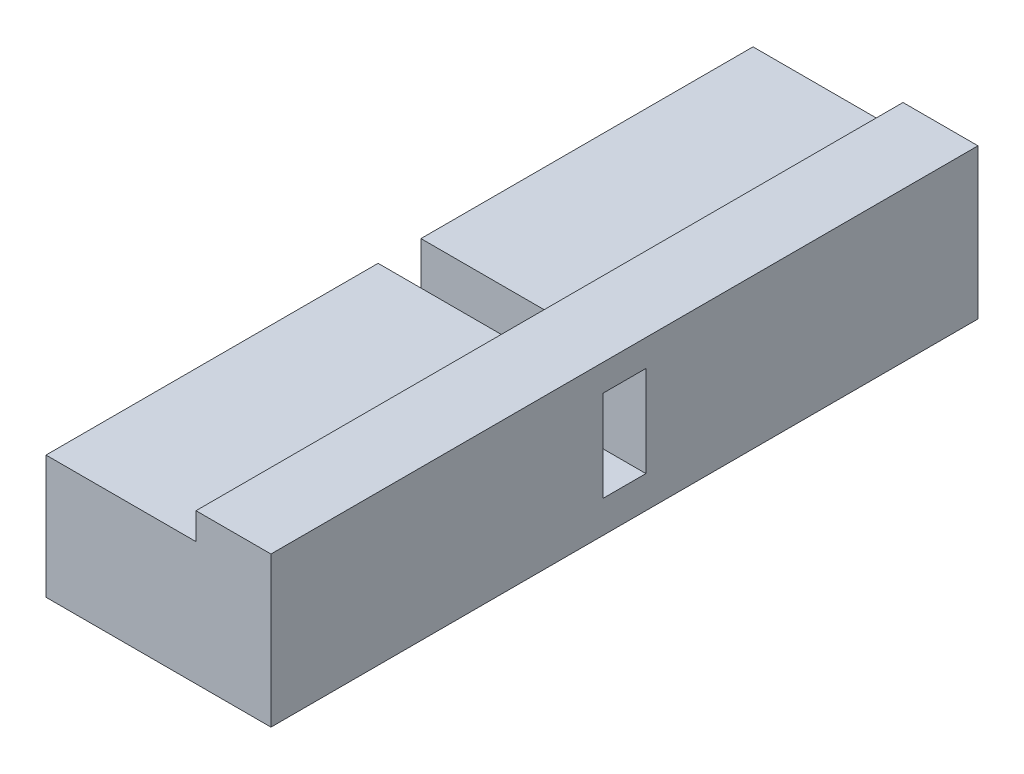
ISO-10303-21;
HEADER;
FILE_DESCRIPTION(('STEP AP214'),'2;1');
FILE_NAME('part.step','',(''),(''),'','','');
FILE_SCHEMA(('AUTOMOTIVE_DESIGN { 1 0 10303 214 1 1 1 1 }'));
ENDSEC;
DATA;
#1=APPLICATION_CONTEXT('core data for automotive mechanical design processes');
#2=APPLICATION_PROTOCOL_DEFINITION('international standard','automotive_design',2000,#1);
#3=PRODUCT_CONTEXT('',#1,'mechanical');
#4=PRODUCT('Part','Part','',(#3));
#5=PRODUCT_RELATED_PRODUCT_CATEGORY('part','',(#4));
#6=PRODUCT_DEFINITION_FORMATION('','',#4);
#7=PRODUCT_DEFINITION_CONTEXT('part definition',#1,'design');
#8=PRODUCT_DEFINITION('design','',#6,#7);
#9=PRODUCT_DEFINITION_SHAPE('','',#8);
#10=(LENGTH_UNIT() NAMED_UNIT(*) SI_UNIT(.MILLI.,.METRE.));
#11=(NAMED_UNIT(*) PLANE_ANGLE_UNIT() SI_UNIT($,.RADIAN.));
#12=(NAMED_UNIT(*) SI_UNIT($,.STERADIAN.) SOLID_ANGLE_UNIT());
#13=UNCERTAINTY_MEASURE_WITH_UNIT(LENGTH_MEASURE(1.E-05),#10,'distance_accuracy_value','');
#14=(GEOMETRIC_REPRESENTATION_CONTEXT(3) GLOBAL_UNCERTAINTY_ASSIGNED_CONTEXT((#13)) GLOBAL_UNIT_ASSIGNED_CONTEXT((#10,
#11,#12)) REPRESENTATION_CONTEXT('',''));
#15=CARTESIAN_POINT('',(0.,0.,0.));
#16=DIRECTION('',(0.,0.,1.));
#17=DIRECTION('',(1.,0.,0.));
#18=AXIS2_PLACEMENT_3D('',#15,#16,#17);
#19=CARTESIAN_POINT('',(-10.5,3.,-33.));
#20=DIRECTION('',(1.,0.,0.));
#21=DIRECTION('',(0.,0.,-1.));
#22=AXIS2_PLACEMENT_3D('',#19,#20,#21);
#23=PLANE('',#22);
#24=DIRECTION('',(0.,0.,1.));
#25=VECTOR('',#24,1.);
#26=CARTESIAN_POINT('',(-10.5,0.,-33.));
#27=LINE('',#26,#25);
#28=CARTESIAN_POINT('',(-10.5,0.,-33.));
#29=VERTEX_POINT('',#28);
#30=CARTESIAN_POINT('',(-10.5,0.,33.));
#31=VERTEX_POINT('',#30);
#32=EDGE_CURVE('E187',#29,#31,#27,.T.);
#33=ORIENTED_EDGE('',*,*,#32,.T.);
#34=DIRECTION('',(0.,-1.,0.));
#35=VECTOR('',#34,1.);
#36=CARTESIAN_POINT('',(-10.5,3.,33.));
#37=LINE('',#36,#35);
#38=CARTESIAN_POINT('',(-10.5,11.5,33.));
#39=VERTEX_POINT('',#38);
#40=EDGE_CURVE('E11',#39,#31,#37,.T.);
#41=ORIENTED_EDGE('',*,*,#40,.F.);
#42=DIRECTION('',(0.,0.,1.));
#43=VECTOR('',#42,1.);
#44=CARTESIAN_POINT('',(-10.5,11.5,2.));
#45=LINE('',#44,#43);
#46=CARTESIAN_POINT('',(-10.5,11.5,2.));
#47=VERTEX_POINT('',#46);
#48=EDGE_CURVE('E157',#47,#39,#45,.T.);
#49=ORIENTED_EDGE('',*,*,#48,.F.);
#50=DIRECTION('',(0.,-1.,0.));
#51=VECTOR('',#50,1.);
#52=CARTESIAN_POINT('',(-10.5,11.5,2.));
#53=LINE('',#52,#51);
#54=CARTESIAN_POINT('',(-10.5,3.,2.));
#55=VERTEX_POINT('',#54);
#56=EDGE_CURVE('E169',#47,#55,#53,.T.);
#57=ORIENTED_EDGE('',*,*,#56,.T.);
#58=DIRECTION('',(0.,0.,1.));
#59=VECTOR('',#58,1.);
#60=CARTESIAN_POINT('',(-10.5,3.,-33.));
#61=LINE('',#60,#59);
#62=CARTESIAN_POINT('',(-10.5,3.,-2.));
#63=VERTEX_POINT('',#62);
#64=EDGE_CURVE('E191',#63,#55,#61,.T.);
#65=ORIENTED_EDGE('',*,*,#64,.F.);
#66=DIRECTION('',(0.,-1.,0.));
#67=VECTOR('',#66,1.);
#68=CARTESIAN_POINT('',(-10.5,11.5,-2.));
#69=LINE('',#68,#67);
#70=CARTESIAN_POINT('',(-10.5,11.5,-2.));
#71=VERTEX_POINT('',#70);
#72=EDGE_CURVE('E186',#71,#63,#69,.T.);
#73=ORIENTED_EDGE('',*,*,#72,.F.);
#74=DIRECTION('',(0.,0.,1.));
#75=VECTOR('',#74,1.);
#76=CARTESIAN_POINT('',(-10.5,11.5,-33.));
#77=LINE('',#76,#75);
#78=CARTESIAN_POINT('',(-10.5,11.5,-33.));
#79=VERTEX_POINT('',#78);
#80=EDGE_CURVE('E177',#79,#71,#77,.T.);
#81=ORIENTED_EDGE('',*,*,#80,.F.);
#82=DIRECTION('',(0.,-1.,0.));
#83=VECTOR('',#82,1.);
#84=CARTESIAN_POINT('',(-10.5,3.,-33.));
#85=LINE('',#84,#83);
#86=EDGE_CURVE('E198',#79,#29,#85,.T.);
#87=ORIENTED_EDGE('',*,*,#86,.T.);
#88=EDGE_LOOP('',(#33,#41,#49,#57,#65,#73,#81,#87));
#89=FACE_BOUND('',#88,.T.);
#90=ADVANCED_FACE('F43',(#89),#23,.F.);
#91=CARTESIAN_POINT('',(-10.5,3.,33.));
#92=DIRECTION('',(0.,0.,-1.));
#93=DIRECTION('',(-1.,0.,0.));
#94=AXIS2_PLACEMENT_3D('',#91,#92,#93);
#95=PLANE('',#94);
#96=DIRECTION('',(1.,0.,0.));
#97=VECTOR('',#96,1.);
#98=CARTESIAN_POINT('',(-10.5,0.,33.));
#99=LINE('',#98,#97);
#100=CARTESIAN_POINT('',(10.5,0.,33.));
#101=VERTEX_POINT('',#100);
#102=EDGE_CURVE('E200',#31,#101,#99,.T.);
#103=ORIENTED_EDGE('',*,*,#102,.T.);
#104=DIRECTION('',(0.,-1.,0.));
#105=VECTOR('',#104,1.);
#106=CARTESIAN_POINT('',(10.5,3.,33.));
#107=LINE('',#106,#105);
#108=CARTESIAN_POINT('',(10.5,14.,33.));
#109=VERTEX_POINT('',#108);
#110=EDGE_CURVE('E49',#109,#101,#107,.T.);
#111=ORIENTED_EDGE('',*,*,#110,.F.);
#112=DIRECTION('',(1.,0.,0.));
#113=VECTOR('',#112,1.);
#114=CARTESIAN_POINT('',(3.5,14.,33.));
#115=LINE('',#114,#113);
#116=CARTESIAN_POINT('',(3.5,14.,33.));
#117=VERTEX_POINT('',#116);
#118=EDGE_CURVE('E125',#117,#109,#115,.T.);
#119=ORIENTED_EDGE('',*,*,#118,.F.);
#120=DIRECTION('',(0.,-1.,0.));
#121=VECTOR('',#120,1.);
#122=CARTESIAN_POINT('',(3.5,14.,33.));
#123=LINE('',#122,#121);
#124=CARTESIAN_POINT('',(3.5,11.5,33.));
#125=VERTEX_POINT('',#124);
#126=EDGE_CURVE('E128',#117,#125,#123,.T.);
#127=ORIENTED_EDGE('',*,*,#126,.T.);
#128=DIRECTION('',(1.,0.,0.));
#129=VECTOR('',#128,1.);
#130=CARTESIAN_POINT('',(-10.5,11.5,33.));
#131=LINE('',#130,#129);
#132=EDGE_CURVE('E165',#39,#125,#131,.T.);
#133=ORIENTED_EDGE('',*,*,#132,.F.);
#134=ORIENTED_EDGE('',*,*,#40,.T.);
#135=EDGE_LOOP('',(#103,#111,#119,#127,#133,#134));
#136=FACE_BOUND('',#135,.T.);
#137=ADVANCED_FACE('F130',(#136),#95,.F.);
#138=CARTESIAN_POINT('',(10.5,3.,33.));
#139=DIRECTION('',(-1.,0.,0.));
#140=DIRECTION('',(0.,0.,1.));
#141=AXIS2_PLACEMENT_3D('',#138,#139,#140);
#142=PLANE('',#141);
#143=DIRECTION('',(0.,-1.,0.));
#144=VECTOR('',#143,1.);
#145=CARTESIAN_POINT('',(10.5,3.,-33.));
#146=LINE('',#145,#144);
#147=CARTESIAN_POINT('',(10.5,14.,-33.));
#148=VERTEX_POINT('',#147);
#149=CARTESIAN_POINT('',(10.5,0.,-33.));
#150=VERTEX_POINT('',#149);
#151=EDGE_CURVE('E206',#148,#150,#146,.T.);
#152=ORIENTED_EDGE('',*,*,#151,.F.);
#153=DIRECTION('',(0.,0.,-1.));
#154=VECTOR('',#153,1.);
#155=CARTESIAN_POINT('',(10.5,14.,33.));
#156=LINE('',#155,#154);
#157=EDGE_CURVE('E132',#109,#148,#156,.T.);
#158=ORIENTED_EDGE('',*,*,#157,.F.);
#159=ORIENTED_EDGE('',*,*,#110,.T.);
#160=DIRECTION('',(0.,0.,-1.));
#161=VECTOR('',#160,1.);
#162=CARTESIAN_POINT('',(10.5,0.,33.));
#163=LINE('',#162,#161);
#164=EDGE_CURVE('E203',#101,#150,#163,.T.);
#165=ORIENTED_EDGE('',*,*,#164,.T.);
#166=EDGE_LOOP('',(#152,#158,#159,#165));
#167=FACE_BOUND('',#166,.T.);
#168=DIRECTION('',(0.,0.,-1.));
#169=VECTOR('',#168,1.);
#170=CARTESIAN_POINT('',(10.5,11.5,33.));
#171=LINE('',#170,#169);
#172=CARTESIAN_POINT('',(10.5,11.5,2.));
#173=VERTEX_POINT('',#172);
#174=CARTESIAN_POINT('',(10.5,11.5,-2.));
#175=VERTEX_POINT('',#174);
#176=EDGE_CURVE('E144',#173,#175,#171,.T.);
#177=ORIENTED_EDGE('',*,*,#176,.T.);
#178=DIRECTION('',(0.,-1.,0.));
#179=VECTOR('',#178,1.);
#180=CARTESIAN_POINT('',(10.5,11.5,-2.));
#181=LINE('',#180,#179);
#182=CARTESIAN_POINT('',(10.5,3.,-2.));
#183=VERTEX_POINT('',#182);
#184=EDGE_CURVE('E185',#175,#183,#181,.T.);
#185=ORIENTED_EDGE('',*,*,#184,.T.);
#186=DIRECTION('',(0.,0.,-1.));
#187=VECTOR('',#186,1.);
#188=CARTESIAN_POINT('',(10.5,3.,33.));
#189=LINE('',#188,#187);
#190=CARTESIAN_POINT('',(10.5,3.,2.));
#191=VERTEX_POINT('',#190);
#192=EDGE_CURVE('E194',#191,#183,#189,.T.);
#193=ORIENTED_EDGE('',*,*,#192,.F.);
#194=DIRECTION('',(0.,-1.,0.));
#195=VECTOR('',#194,1.);
#196=CARTESIAN_POINT('',(10.5,11.5,2.));
#197=LINE('',#196,#195);
#198=EDGE_CURVE('E175',#173,#191,#197,.T.);
#199=ORIENTED_EDGE('',*,*,#198,.F.);
#200=EDGE_LOOP('',(#177,#185,#193,#199));
#201=FACE_BOUND('',#200,.T.);
#202=ADVANCED_FACE('F209',(#167,#201),#142,.F.);
#203=CARTESIAN_POINT('',(10.5,3.,-33.));
#204=DIRECTION('',(0.,0.,1.));
#205=DIRECTION('',(1.,0.,0.));
#206=AXIS2_PLACEMENT_3D('',#203,#204,#205);
#207=PLANE('',#206);
#208=DIRECTION('',(-1.,0.,0.));
#209=VECTOR('',#208,1.);
#210=CARTESIAN_POINT('',(10.5,0.,-33.));
#211=LINE('',#210,#209);
#212=EDGE_CURVE('E193',#150,#29,#211,.T.);
#213=ORIENTED_EDGE('',*,*,#212,.T.);
#214=ORIENTED_EDGE('',*,*,#86,.F.);
#215=DIRECTION('',(-1.,0.,0.));
#216=VECTOR('',#215,1.);
#217=CARTESIAN_POINT('',(10.5,11.5,-33.));
#218=LINE('',#217,#216);
#219=CARTESIAN_POINT('',(3.5,11.5,-33.));
#220=VERTEX_POINT('',#219);
#221=EDGE_CURVE('E180',#220,#79,#218,.T.);
#222=ORIENTED_EDGE('',*,*,#221,.F.);
#223=DIRECTION('',(0.,-1.,0.));
#224=VECTOR('',#223,1.);
#225=CARTESIAN_POINT('',(3.5,14.,-33.));
#226=LINE('',#225,#224);
#227=CARTESIAN_POINT('',(3.5,14.,-33.));
#228=VERTEX_POINT('',#227);
#229=EDGE_CURVE('E147',#228,#220,#226,.T.);
#230=ORIENTED_EDGE('',*,*,#229,.F.);
#231=DIRECTION('',(-1.,0.,0.));
#232=VECTOR('',#231,1.);
#233=CARTESIAN_POINT('',(10.5,14.,-33.));
#234=LINE('',#233,#232);
#235=EDGE_CURVE('E143',#148,#228,#234,.T.);
#236=ORIENTED_EDGE('',*,*,#235,.F.);
#237=ORIENTED_EDGE('',*,*,#151,.T.);
#238=EDGE_LOOP('',(#213,#214,#222,#230,#236,#237));
#239=FACE_BOUND('',#238,.T.);
#240=ADVANCED_FACE('F217',(#239),#207,.F.);
#241=CARTESIAN_POINT('',(0.,3.,0.));
#242=DIRECTION('',(0.,1.,0.));
#243=DIRECTION('',(0.,0.,1.));
#244=AXIS2_PLACEMENT_3D('',#241,#242,#243);
#245=PLANE('',#244);
#246=DIRECTION('',(-1.,0.,0.));
#247=VECTOR('',#246,1.);
#248=CARTESIAN_POINT('',(10.5,3.,2.));
#249=LINE('',#248,#247);
#250=EDGE_CURVE('E153',#191,#55,#249,.T.);
#251=ORIENTED_EDGE('',*,*,#250,.F.);
#252=ORIENTED_EDGE('',*,*,#192,.T.);
#253=DIRECTION('',(1.,0.,0.));
#254=VECTOR('',#253,1.);
#255=CARTESIAN_POINT('',(-10.5,3.,-2.));
#256=LINE('',#255,#254);
#257=EDGE_CURVE('E176',#63,#183,#256,.T.);
#258=ORIENTED_EDGE('',*,*,#257,.F.);
#259=ORIENTED_EDGE('',*,*,#64,.T.);
#260=EDGE_LOOP('',(#251,#252,#258,#259));
#261=FACE_BOUND('',#260,.T.);
#262=ADVANCED_FACE('F239',(#261),#245,.T.);
#263=CARTESIAN_POINT('',(0.,0.,0.));
#264=DIRECTION('',(0.,1.,0.));
#265=DIRECTION('',(0.,0.,1.));
#266=AXIS2_PLACEMENT_3D('',#263,#264,#265);
#267=PLANE('',#266);
#268=ORIENTED_EDGE('',*,*,#32,.F.);
#269=ORIENTED_EDGE('',*,*,#212,.F.);
#270=ORIENTED_EDGE('',*,*,#164,.F.);
#271=ORIENTED_EDGE('',*,*,#102,.F.);
#272=EDGE_LOOP('',(#268,#269,#270,#271));
#273=FACE_BOUND('',#272,.T.);
#274=ADVANCED_FACE('F214',(#273),#267,.F.);
#275=CARTESIAN_POINT('',(-10.5,11.5,-2.));
#276=DIRECTION('',(0.,0.,-1.));
#277=DIRECTION('',(-1.,0.,0.));
#278=AXIS2_PLACEMENT_3D('',#275,#276,#277);
#279=PLANE('',#278);
#280=ORIENTED_EDGE('',*,*,#257,.T.);
#281=ORIENTED_EDGE('',*,*,#184,.F.);
#282=DIRECTION('',(1.,0.,0.));
#283=VECTOR('',#282,1.);
#284=CARTESIAN_POINT('',(-10.5,11.5,-2.));
#285=LINE('',#284,#283);
#286=CARTESIAN_POINT('',(3.5,11.5,-2.));
#287=VERTEX_POINT('',#286);
#288=EDGE_CURVE('E149',#287,#175,#285,.T.);
#289=ORIENTED_EDGE('',*,*,#288,.F.);
#290=EDGE_CURVE('E154',#71,#287,#285,.T.);
#291=ORIENTED_EDGE('',*,*,#290,.F.);
#292=ORIENTED_EDGE('',*,*,#72,.T.);
#293=EDGE_LOOP('',(#280,#281,#289,#291,#292));
#294=FACE_BOUND('',#293,.T.);
#295=ADVANCED_FACE('F240',(#294),#279,.F.);
#296=CARTESIAN_POINT('',(0.,11.5,0.));
#297=DIRECTION('',(0.,1.,0.));
#298=DIRECTION('',(0.,0.,1.));
#299=AXIS2_PLACEMENT_3D('',#296,#297,#298);
#300=PLANE('',#299);
#301=DIRECTION('',(0.,0.,1.));
#302=VECTOR('',#301,1.);
#303=CARTESIAN_POINT('',(3.5,11.5,-33.));
#304=LINE('',#303,#302);
#305=EDGE_CURVE('E60',#220,#287,#304,.T.);
#306=ORIENTED_EDGE('',*,*,#305,.F.);
#307=ORIENTED_EDGE('',*,*,#221,.T.);
#308=ORIENTED_EDGE('',*,*,#80,.T.);
#309=ORIENTED_EDGE('',*,*,#290,.T.);
#310=EDGE_LOOP('',(#306,#307,#308,#309));
#311=FACE_BOUND('',#310,.T.);
#312=ADVANCED_FACE('F224',(#311),#300,.T.);
#313=CARTESIAN_POINT('',(10.5,11.5,2.));
#314=DIRECTION('',(0.,0.,1.));
#315=DIRECTION('',(1.,0.,0.));
#316=AXIS2_PLACEMENT_3D('',#313,#314,#315);
#317=PLANE('',#316);
#318=ORIENTED_EDGE('',*,*,#250,.T.);
#319=ORIENTED_EDGE('',*,*,#56,.F.);
#320=DIRECTION('',(-1.,0.,0.));
#321=VECTOR('',#320,1.);
#322=CARTESIAN_POINT('',(10.5,11.5,2.));
#323=LINE('',#322,#321);
#324=CARTESIAN_POINT('',(3.5,11.5,2.));
#325=VERTEX_POINT('',#324);
#326=EDGE_CURVE('E163',#325,#47,#323,.T.);
#327=ORIENTED_EDGE('',*,*,#326,.F.);
#328=EDGE_CURVE('E164',#173,#325,#323,.T.);
#329=ORIENTED_EDGE('',*,*,#328,.F.);
#330=ORIENTED_EDGE('',*,*,#198,.T.);
#331=EDGE_LOOP('',(#318,#319,#327,#329,#330));
#332=FACE_BOUND('',#331,.T.);
#333=ADVANCED_FACE('F245',(#332),#317,.F.);
#334=CARTESIAN_POINT('',(0.,11.5,0.));
#335=DIRECTION('',(0.,1.,0.));
#336=DIRECTION('',(0.,0.,1.));
#337=AXIS2_PLACEMENT_3D('',#334,#335,#336);
#338=PLANE('',#337);
#339=EDGE_CURVE('E62',#325,#125,#304,.T.);
#340=ORIENTED_EDGE('',*,*,#339,.F.);
#341=ORIENTED_EDGE('',*,*,#326,.T.);
#342=ORIENTED_EDGE('',*,*,#48,.T.);
#343=ORIENTED_EDGE('',*,*,#132,.T.);
#344=EDGE_LOOP('',(#340,#341,#342,#343));
#345=FACE_BOUND('',#344,.T.);
#346=ADVANCED_FACE('F243',(#345),#338,.T.);
#347=CARTESIAN_POINT('',(0.,11.5,0.));
#348=DIRECTION('',(0.,1.,0.));
#349=DIRECTION('',(0.,0.,1.));
#350=AXIS2_PLACEMENT_3D('',#347,#348,#349);
#351=PLANE('',#350);
#352=EDGE_CURVE('E229',#287,#325,#304,.T.);
#353=ORIENTED_EDGE('',*,*,#352,.F.);
#354=ORIENTED_EDGE('',*,*,#288,.T.);
#355=ORIENTED_EDGE('',*,*,#176,.F.);
#356=ORIENTED_EDGE('',*,*,#328,.T.);
#357=EDGE_LOOP('',(#353,#354,#355,#356));
#358=FACE_BOUND('',#357,.T.);
#359=ADVANCED_FACE('F235',(#358),#351,.F.);
#360=CARTESIAN_POINT('',(3.5,14.,-33.));
#361=DIRECTION('',(1.,0.,0.));
#362=DIRECTION('',(0.,0.,-1.));
#363=AXIS2_PLACEMENT_3D('',#360,#361,#362);
#364=PLANE('',#363);
#365=ORIENTED_EDGE('',*,*,#305,.T.);
#366=ORIENTED_EDGE('',*,*,#352,.T.);
#367=ORIENTED_EDGE('',*,*,#339,.T.);
#368=ORIENTED_EDGE('',*,*,#126,.F.);
#369=DIRECTION('',(0.,0.,1.));
#370=VECTOR('',#369,1.);
#371=CARTESIAN_POINT('',(3.5,14.,-33.));
#372=LINE('',#371,#370);
#373=EDGE_CURVE('E136',#228,#117,#372,.T.);
#374=ORIENTED_EDGE('',*,*,#373,.F.);
#375=ORIENTED_EDGE('',*,*,#229,.T.);
#376=EDGE_LOOP('',(#365,#366,#367,#368,#374,#375));
#377=FACE_BOUND('',#376,.T.);
#378=ADVANCED_FACE('F150',(#377),#364,.F.);
#379=CARTESIAN_POINT('',(0.,14.,0.));
#380=DIRECTION('',(0.,1.,0.));
#381=DIRECTION('',(0.,0.,1.));
#382=AXIS2_PLACEMENT_3D('',#379,#380,#381);
#383=PLANE('',#382);
#384=ORIENTED_EDGE('',*,*,#373,.T.);
#385=ORIENTED_EDGE('',*,*,#118,.T.);
#386=ORIENTED_EDGE('',*,*,#157,.T.);
#387=ORIENTED_EDGE('',*,*,#235,.T.);
#388=EDGE_LOOP('',(#384,#385,#386,#387));
#389=FACE_BOUND('',#388,.T.);
#390=ADVANCED_FACE('F138',(#389),#383,.T.);
#391=CLOSED_SHELL('',(#90,#137,#202,#240,#262,#274,#295,#312,#333,#346,#359,#378,#390));
#392=MANIFOLD_SOLID_BREP('B2',#391);
#393=ADVANCED_BREP_SHAPE_REPRESENTATION('',(#18,#392),#14);
#394=SHAPE_DEFINITION_REPRESENTATION(#9,#393);
ENDSEC;
END-ISO-10303-21;
